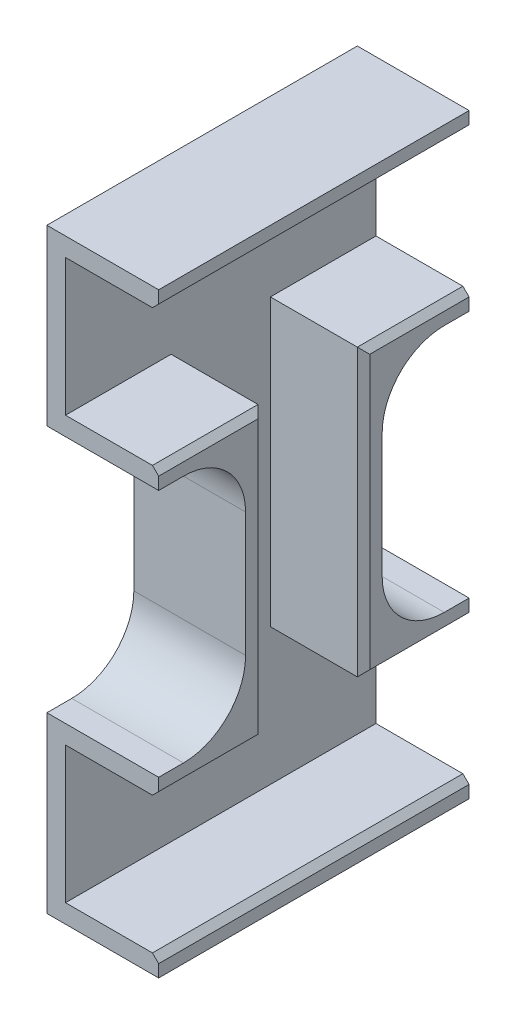
ISO-10303-21;
HEADER;
FILE_DESCRIPTION(('STEP AP214'),'2;1');
FILE_NAME('part.step','',(''),(''),'','','');
FILE_SCHEMA(('AUTOMOTIVE_DESIGN { 1 0 10303 214 1 1 1 1 }'));
ENDSEC;
DATA;
#1=APPLICATION_CONTEXT('core data for automotive mechanical design processes');
#2=APPLICATION_PROTOCOL_DEFINITION('international standard','automotive_design',2000,#1);
#3=PRODUCT_CONTEXT('',#1,'mechanical');
#4=PRODUCT('Part','Part','',(#3));
#5=PRODUCT_RELATED_PRODUCT_CATEGORY('part','',(#4));
#6=PRODUCT_DEFINITION_FORMATION('','',#4);
#7=PRODUCT_DEFINITION_CONTEXT('part definition',#1,'design');
#8=PRODUCT_DEFINITION('design','',#6,#7);
#9=PRODUCT_DEFINITION_SHAPE('','',#8);
#10=(LENGTH_UNIT() NAMED_UNIT(*) SI_UNIT(.MILLI.,.METRE.));
#11=(NAMED_UNIT(*) PLANE_ANGLE_UNIT() SI_UNIT($,.RADIAN.));
#12=(NAMED_UNIT(*) SI_UNIT($,.STERADIAN.) SOLID_ANGLE_UNIT());
#13=UNCERTAINTY_MEASURE_WITH_UNIT(LENGTH_MEASURE(1.E-05),#10,'distance_accuracy_value','');
#14=(GEOMETRIC_REPRESENTATION_CONTEXT(3) GLOBAL_UNCERTAINTY_ASSIGNED_CONTEXT((#13)) GLOBAL_UNIT_ASSIGNED_CONTEXT((#10,
#11,#12)) REPRESENTATION_CONTEXT('',''));
#15=CARTESIAN_POINT('',(0.,0.,0.));
#16=DIRECTION('',(0.,0.,1.));
#17=DIRECTION('',(1.,0.,0.));
#18=AXIS2_PLACEMENT_3D('',#15,#16,#17);
#19=CARTESIAN_POINT('',(18.,0.,-50.));
#20=DIRECTION('',(0.,0.,1.));
#21=DIRECTION('',(1.,0.,0.));
#22=AXIS2_PLACEMENT_3D('',#19,#20,#21);
#23=PLANE('',#22);
#24=DIRECTION('',(1.,0.,0.));
#25=VECTOR('',#24,1.);
#26=CARTESIAN_POINT('',(3.,3.,-50.));
#27=LINE('',#26,#25);
#28=CARTESIAN_POINT('',(3.,3.,-50.));
#29=VERTEX_POINT('',#28);
#30=CARTESIAN_POINT('',(17.,3.,-50.));
#31=VERTEX_POINT('',#30);
#32=EDGE_CURVE('E597',#29,#31,#27,.T.);
#33=ORIENTED_EDGE('',*,*,#32,.T.);
#34=DIRECTION('',(0.707106781186548,-0.707106781186548,0.));
#35=VECTOR('',#34,1.);
#36=CARTESIAN_POINT('',(17.,3.,-50.));
#37=LINE('',#36,#35);
#38=CARTESIAN_POINT('',(18.,1.99999999999997,-50.));
#39=VERTEX_POINT('',#38);
#40=EDGE_CURVE('E484',#31,#39,#37,.T.);
#41=ORIENTED_EDGE('',*,*,#40,.T.);
#42=DIRECTION('',(0.,1.,0.));
#43=VECTOR('',#42,1.);
#44=CARTESIAN_POINT('',(18.,0.,-50.));
#45=LINE('',#44,#43);
#46=CARTESIAN_POINT('',(18.,0.,-50.));
#47=VERTEX_POINT('',#46);
#48=EDGE_CURVE('E336',#47,#39,#45,.T.);
#49=ORIENTED_EDGE('',*,*,#48,.F.);
#50=DIRECTION('',(-1.,0.,0.));
#51=VECTOR('',#50,1.);
#52=CARTESIAN_POINT('',(18.,0.,-50.));
#53=LINE('',#52,#51);
#54=CARTESIAN_POINT('',(0.,0.,-50.));
#55=VERTEX_POINT('',#54);
#56=EDGE_CURVE('E415',#47,#55,#53,.T.);
#57=ORIENTED_EDGE('',*,*,#56,.T.);
#58=DIRECTION('',(0.,1.,0.));
#59=VECTOR('',#58,1.);
#60=CARTESIAN_POINT('',(0.,0.,-50.));
#61=LINE('',#60,#59);
#62=CARTESIAN_POINT('',(0.,28.,-50.));
#63=VERTEX_POINT('',#62);
#64=EDGE_CURVE('E380',#55,#63,#61,.T.);
#65=ORIENTED_EDGE('',*,*,#64,.T.);
#66=DIRECTION('',(-1.,0.,0.));
#67=VECTOR('',#66,1.);
#68=CARTESIAN_POINT('',(18.,28.,-50.));
#69=LINE('',#68,#67);
#70=CARTESIAN_POINT('',(18.,28.,-50.));
#71=VERTEX_POINT('',#70);
#72=EDGE_CURVE('E411',#71,#63,#69,.T.);
#73=ORIENTED_EDGE('',*,*,#72,.F.);
#74=CARTESIAN_POINT('',(18.,26.,-50.));
#75=VERTEX_POINT('',#74);
#76=EDGE_CURVE('E335',#75,#71,#45,.T.);
#77=ORIENTED_EDGE('',*,*,#76,.F.);
#78=DIRECTION('',(0.707106781186548,0.707106781186548,0.));
#79=VECTOR('',#78,1.);
#80=CARTESIAN_POINT('',(18.,26.,-50.));
#81=LINE('',#80,#79);
#82=CARTESIAN_POINT('',(17.,25.,-50.));
#83=VERTEX_POINT('',#82);
#84=EDGE_CURVE('E481',#75,#83,#81,.F.);
#85=ORIENTED_EDGE('',*,*,#84,.T.);
#86=DIRECTION('',(1.,0.,0.));
#87=VECTOR('',#86,1.);
#88=CARTESIAN_POINT('',(3.,25.,-50.));
#89=LINE('',#88,#87);
#90=CARTESIAN_POINT('',(3.,25.,-50.));
#91=VERTEX_POINT('',#90);
#92=EDGE_CURVE('E594',#91,#83,#89,.T.);
#93=ORIENTED_EDGE('',*,*,#92,.F.);
#94=DIRECTION('',(0.,1.,0.));
#95=VECTOR('',#94,1.);
#96=CARTESIAN_POINT('',(3.,0.,-50.));
#97=LINE('',#96,#95);
#98=EDGE_CURVE('E646',#29,#91,#97,.T.);
#99=ORIENTED_EDGE('',*,*,#98,.F.);
#100=EDGE_LOOP('',(#33,#41,#49,#57,#65,#73,#77,#85,#93,#99));
#101=FACE_BOUND('',#100,.T.);
#102=ADVANCED_FACE('F47',(#101),#23,.F.);
#103=CARTESIAN_POINT('',(18.,0.,-50.));
#104=DIRECTION('',(0.,0.,1.));
#105=DIRECTION('',(1.,0.,0.));
#106=AXIS2_PLACEMENT_3D('',#103,#104,#105);
#107=PLANE('',#106);
#108=DIRECTION('',(0.,1.,0.));
#109=VECTOR('',#108,1.);
#110=CARTESIAN_POINT('',(18.,0.,-50.));
#111=LINE('',#110,#109);
#112=CARTESIAN_POINT('',(18.,94.,-50.));
#113=VERTEX_POINT('',#112);
#114=CARTESIAN_POINT('',(18.,96.,-50.));
#115=VERTEX_POINT('',#114);
#116=EDGE_CURVE('E349',#113,#115,#111,.T.);
#117=ORIENTED_EDGE('',*,*,#116,.F.);
#118=DIRECTION('',(0.707106781186548,0.707106781186548,0.));
#119=VECTOR('',#118,1.);
#120=CARTESIAN_POINT('',(18.,94.,-50.));
#121=LINE('',#120,#119);
#122=CARTESIAN_POINT('',(17.,93.,-50.));
#123=VERTEX_POINT('',#122);
#124=EDGE_CURVE('E503',#113,#123,#121,.F.);
#125=ORIENTED_EDGE('',*,*,#124,.T.);
#126=DIRECTION('',(1.,0.,0.));
#127=VECTOR('',#126,1.);
#128=CARTESIAN_POINT('',(3.,93.,-50.));
#129=LINE('',#128,#127);
#130=CARTESIAN_POINT('',(3.,93.,-50.));
#131=VERTEX_POINT('',#130);
#132=EDGE_CURVE('E582',#131,#123,#129,.T.);
#133=ORIENTED_EDGE('',*,*,#132,.F.);
#134=DIRECTION('',(0.,1.,0.));
#135=VECTOR('',#134,1.);
#136=CARTESIAN_POINT('',(3.,0.,-50.));
#137=LINE('',#136,#135);
#138=CARTESIAN_POINT('',(3.,71.,-50.));
#139=VERTEX_POINT('',#138);
#140=EDGE_CURVE('E308',#139,#131,#137,.T.);
#141=ORIENTED_EDGE('',*,*,#140,.F.);
#142=DIRECTION('',(1.,0.,0.));
#143=VECTOR('',#142,1.);
#144=CARTESIAN_POINT('',(3.,71.,-50.));
#145=LINE('',#144,#143);
#146=CARTESIAN_POINT('',(17.,71.,-50.));
#147=VERTEX_POINT('',#146);
#148=EDGE_CURVE('E572',#139,#147,#145,.T.);
#149=ORIENTED_EDGE('',*,*,#148,.T.);
#150=DIRECTION('',(0.707106781186548,-0.707106781186548,0.));
#151=VECTOR('',#150,1.);
#152=CARTESIAN_POINT('',(17.,71.,-50.));
#153=LINE('',#152,#151);
#154=CARTESIAN_POINT('',(18.,70.,-50.));
#155=VERTEX_POINT('',#154);
#156=EDGE_CURVE('E500',#147,#155,#153,.T.);
#157=ORIENTED_EDGE('',*,*,#156,.T.);
#158=CARTESIAN_POINT('',(18.,68.,-50.));
#159=VERTEX_POINT('',#158);
#160=EDGE_CURVE('E344',#159,#155,#111,.T.);
#161=ORIENTED_EDGE('',*,*,#160,.F.);
#162=DIRECTION('',(-1.,0.,0.));
#163=VECTOR('',#162,1.);
#164=CARTESIAN_POINT('',(18.,68.,-50.));
#165=LINE('',#164,#163);
#166=CARTESIAN_POINT('',(0.,68.,-50.));
#167=VERTEX_POINT('',#166);
#168=EDGE_CURVE('E407',#159,#167,#165,.T.);
#169=ORIENTED_EDGE('',*,*,#168,.T.);
#170=DIRECTION('',(0.,1.,0.));
#171=VECTOR('',#170,1.);
#172=CARTESIAN_POINT('',(0.,0.,-50.));
#173=LINE('',#172,#171);
#174=CARTESIAN_POINT('',(0.,96.,-50.));
#175=VERTEX_POINT('',#174);
#176=EDGE_CURVE('E388',#167,#175,#173,.T.);
#177=ORIENTED_EDGE('',*,*,#176,.T.);
#178=DIRECTION('',(-1.,0.,0.));
#179=VECTOR('',#178,1.);
#180=CARTESIAN_POINT('',(18.,96.,-50.));
#181=LINE('',#180,#179);
#182=EDGE_CURVE('E404',#115,#175,#181,.T.);
#183=ORIENTED_EDGE('',*,*,#182,.F.);
#184=EDGE_LOOP('',(#117,#125,#133,#141,#149,#157,#161,#169,#177,#183));
#185=FACE_BOUND('',#184,.T.);
#186=ADVANCED_FACE('F578',(#185),#107,.F.);
#187=CARTESIAN_POINT('',(18.,0.,0.));
#188=DIRECTION('',(0.,0.,1.));
#189=DIRECTION('',(1.,0.,0.));
#190=AXIS2_PLACEMENT_3D('',#187,#188,#189);
#191=PLANE('',#190);
#192=DIRECTION('',(1.,0.,0.));
#193=VECTOR('',#192,1.);
#194=CARTESIAN_POINT('',(3.,93.,0.));
#195=LINE('',#194,#193);
#196=CARTESIAN_POINT('',(3.,93.,0.));
#197=VERTEX_POINT('',#196);
#198=CARTESIAN_POINT('',(17.,93.,0.));
#199=VERTEX_POINT('',#198);
#200=EDGE_CURVE('E363',#197,#199,#195,.T.);
#201=ORIENTED_EDGE('',*,*,#200,.T.);
#202=DIRECTION('',(-0.707106781186548,-0.707106781186548,0.));
#203=VECTOR('',#202,1.);
#204=CARTESIAN_POINT('',(-29.,47.,0.));
#205=LINE('',#204,#203);
#206=CARTESIAN_POINT('',(18.,94.,0.));
#207=VERTEX_POINT('',#206);
#208=EDGE_CURVE('E511',#199,#207,#205,.F.);
#209=ORIENTED_EDGE('',*,*,#208,.T.);
#210=DIRECTION('',(0.,1.,0.));
#211=VECTOR('',#210,1.);
#212=CARTESIAN_POINT('',(18.,0.,0.));
#213=LINE('',#212,#211);
#214=CARTESIAN_POINT('',(18.,96.,0.));
#215=VERTEX_POINT('',#214);
#216=EDGE_CURVE('E353',#207,#215,#213,.T.);
#217=ORIENTED_EDGE('',*,*,#216,.T.);
#218=DIRECTION('',(-1.,0.,0.));
#219=VECTOR('',#218,1.);
#220=CARTESIAN_POINT('',(18.,96.,0.));
#221=LINE('',#220,#219);
#222=CARTESIAN_POINT('',(0.,96.,0.));
#223=VERTEX_POINT('',#222);
#224=EDGE_CURVE('E401',#215,#223,#221,.T.);
#225=ORIENTED_EDGE('',*,*,#224,.T.);
#226=DIRECTION('',(0.,1.,0.));
#227=VECTOR('',#226,1.);
#228=CARTESIAN_POINT('',(0.,0.,0.));
#229=LINE('',#228,#227);
#230=CARTESIAN_POINT('',(0.,68.,0.));
#231=VERTEX_POINT('',#230);
#232=EDGE_CURVE('E317',#231,#223,#229,.T.);
#233=ORIENTED_EDGE('',*,*,#232,.F.);
#234=DIRECTION('',(-1.,0.,0.));
#235=VECTOR('',#234,1.);
#236=CARTESIAN_POINT('',(18.,68.,0.));
#237=LINE('',#236,#235);
#238=CARTESIAN_POINT('',(18.,68.,0.));
#239=VERTEX_POINT('',#238);
#240=EDGE_CURVE('E357',#239,#231,#237,.T.);
#241=ORIENTED_EDGE('',*,*,#240,.F.);
#242=CARTESIAN_POINT('',(18.,70.,0.));
#243=VERTEX_POINT('',#242);
#244=EDGE_CURVE('E354',#239,#243,#213,.T.);
#245=ORIENTED_EDGE('',*,*,#244,.T.);
#246=DIRECTION('',(-0.707106781186548,0.707106781186548,0.));
#247=VECTOR('',#246,1.);
#248=CARTESIAN_POINT('',(53.,35.,0.));
#249=LINE('',#248,#247);
#250=CARTESIAN_POINT('',(17.,71.,0.));
#251=VERTEX_POINT('',#250);
#252=EDGE_CURVE('E301',#243,#251,#249,.T.);
#253=ORIENTED_EDGE('',*,*,#252,.T.);
#254=DIRECTION('',(1.,0.,0.));
#255=VECTOR('',#254,1.);
#256=CARTESIAN_POINT('',(3.,71.,0.));
#257=LINE('',#256,#255);
#258=CARTESIAN_POINT('',(3.,71.,0.));
#259=VERTEX_POINT('',#258);
#260=EDGE_CURVE('E276',#259,#251,#257,.T.);
#261=ORIENTED_EDGE('',*,*,#260,.F.);
#262=DIRECTION('',(0.,-1.,0.));
#263=VECTOR('',#262,1.);
#264=CARTESIAN_POINT('',(3.,0.,0.));
#265=LINE('',#264,#263);
#266=EDGE_CURVE('E285',#197,#259,#265,.T.);
#267=ORIENTED_EDGE('',*,*,#266,.F.);
#268=EDGE_LOOP('',(#201,#209,#217,#225,#233,#241,#245,#253,#261,#267));
#269=FACE_BOUND('',#268,.T.);
#270=ADVANCED_FACE('F298',(#269),#191,.T.);
#271=CARTESIAN_POINT('',(18.,0.,0.));
#272=DIRECTION('',(1.,0.,0.));
#273=DIRECTION('',(0.,0.,-1.));
#274=AXIS2_PLACEMENT_3D('',#271,#272,#273);
#275=PLANE('',#274);
#276=ORIENTED_EDGE('',*,*,#216,.F.);
#277=DIRECTION('',(0.,0.,-1.));
#278=VECTOR('',#277,1.);
#279=CARTESIAN_POINT('',(18.,94.,0.));
#280=LINE('',#279,#278);
#281=EDGE_CURVE('E496',#207,#113,#280,.T.);
#282=ORIENTED_EDGE('',*,*,#281,.T.);
#283=ORIENTED_EDGE('',*,*,#116,.T.);
#284=DIRECTION('',(0.,0.,-1.));
#285=VECTOR('',#284,1.);
#286=CARTESIAN_POINT('',(18.,96.,0.));
#287=LINE('',#286,#285);
#288=EDGE_CURVE('E348',#215,#115,#287,.T.);
#289=ORIENTED_EDGE('',*,*,#288,.F.);
#290=EDGE_LOOP('',(#276,#282,#283,#289));
#291=FACE_BOUND('',#290,.T.);
#292=ADVANCED_FACE('F735',(#291),#275,.T.);
#293=DIRECTION('',(0.,-1.,0.));
#294=VECTOR('',#293,1.);
#295=CARTESIAN_POINT('',(18.,0.,-34.0000000000001));
#296=LINE('',#295,#294);
#297=CARTESIAN_POINT('',(18.,70.,-34.));
#298=VERTEX_POINT('',#297);
#299=CARTESIAN_POINT('',(18.,26.,-34.));
#300=VERTEX_POINT('',#299);
#301=EDGE_CURVE('E536',#298,#300,#296,.T.);
#302=ORIENTED_EDGE('',*,*,#301,.T.);
#303=DIRECTION('',(0.,0.,-1.));
#304=VECTOR('',#303,1.);
#305=CARTESIAN_POINT('',(18.,26.,0.));
#306=LINE('',#305,#304);
#307=EDGE_CURVE('E539',#300,#75,#306,.T.);
#308=ORIENTED_EDGE('',*,*,#307,.T.);
#309=ORIENTED_EDGE('',*,*,#76,.T.);
#310=DIRECTION('',(0.,0.,-1.));
#311=VECTOR('',#310,1.);
#312=CARTESIAN_POINT('',(18.,28.,0.));
#313=LINE('',#312,#311);
#314=CARTESIAN_POINT('',(18.,28.,-46.));
#315=VERTEX_POINT('',#314);
#316=EDGE_CURVE('E327',#315,#71,#313,.T.);
#317=ORIENTED_EDGE('',*,*,#316,.F.);
#318=CARTESIAN_POINT('',(18.,38.,-46.));
#319=DIRECTION('',(1.,0.,0.));
#320=DIRECTION('',(0.,0.,-1.));
#321=AXIS2_PLACEMENT_3D('',#318,#319,#320);
#322=CIRCLE('',#321,10.);
#323=CARTESIAN_POINT('',(18.,38.,-36.));
#324=VERTEX_POINT('',#323);
#325=EDGE_CURVE('E456',#315,#324,#322,.F.);
#326=ORIENTED_EDGE('',*,*,#325,.T.);
#327=DIRECTION('',(0.,1.,0.));
#328=VECTOR('',#327,1.);
#329=CARTESIAN_POINT('',(18.,0.,-36.));
#330=LINE('',#329,#328);
#331=CARTESIAN_POINT('',(18.,58.,-36.));
#332=VERTEX_POINT('',#331);
#333=EDGE_CURVE('E340',#324,#332,#330,.T.);
#334=ORIENTED_EDGE('',*,*,#333,.T.);
#335=CARTESIAN_POINT('',(18.,58.,-46.));
#336=DIRECTION('',(1.,0.,0.));
#337=DIRECTION('',(0.,0.,-1.));
#338=AXIS2_PLACEMENT_3D('',#335,#336,#337);
#339=CIRCLE('',#338,10.);
#340=CARTESIAN_POINT('',(18.,68.,-46.));
#341=VERTEX_POINT('',#340);
#342=EDGE_CURVE('E462',#332,#341,#339,.F.);
#343=ORIENTED_EDGE('',*,*,#342,.T.);
#344=DIRECTION('',(0.,0.,-1.));
#345=VECTOR('',#344,1.);
#346=CARTESIAN_POINT('',(18.,68.,0.));
#347=LINE('',#346,#345);
#348=EDGE_CURVE('E318',#341,#159,#347,.T.);
#349=ORIENTED_EDGE('',*,*,#348,.T.);
#350=ORIENTED_EDGE('',*,*,#160,.T.);
#351=DIRECTION('',(0.,0.,1.));
#352=VECTOR('',#351,1.);
#353=CARTESIAN_POINT('',(18.,70.,-33.));
#354=LINE('',#353,#352);
#355=EDGE_CURVE('E533',#155,#298,#354,.T.);
#356=ORIENTED_EDGE('',*,*,#355,.T.);
#357=EDGE_LOOP('',(#302,#308,#309,#317,#326,#334,#343,#349,#350,#356));
#358=FACE_BOUND('',#357,.T.);
#359=ADVANCED_FACE('F719',(#358),#275,.T.);
#360=DIRECTION('',(0.,1.,0.));
#361=VECTOR('',#360,1.);
#362=CARTESIAN_POINT('',(18.,0.,0.));
#363=LINE('',#362,#361);
#364=CARTESIAN_POINT('',(18.,26.,0.));
#365=VERTEX_POINT('',#364);
#366=CARTESIAN_POINT('',(18.,28.,0.));
#367=VERTEX_POINT('',#366);
#368=EDGE_CURVE('E326',#365,#367,#363,.T.);
#369=ORIENTED_EDGE('',*,*,#368,.F.);
#370=DIRECTION('',(0.,0.,-1.));
#371=VECTOR('',#370,1.);
#372=CARTESIAN_POINT('',(18.,26.,0.));
#373=LINE('',#372,#371);
#374=CARTESIAN_POINT('',(18.,26.,-16.));
#375=VERTEX_POINT('',#374);
#376=EDGE_CURVE('E520',#365,#375,#373,.T.);
#377=ORIENTED_EDGE('',*,*,#376,.T.);
#378=DIRECTION('',(0.,1.,0.));
#379=VECTOR('',#378,1.);
#380=CARTESIAN_POINT('',(18.,71.,-16.));
#381=LINE('',#380,#379);
#382=CARTESIAN_POINT('',(18.,70.,-16.));
#383=VERTEX_POINT('',#382);
#384=EDGE_CURVE('E517',#375,#383,#381,.T.);
#385=ORIENTED_EDGE('',*,*,#384,.T.);
#386=DIRECTION('',(0.,0.,1.));
#387=VECTOR('',#386,1.);
#388=CARTESIAN_POINT('',(18.,70.,0.));
#389=LINE('',#388,#387);
#390=EDGE_CURVE('E514',#383,#243,#389,.T.);
#391=ORIENTED_EDGE('',*,*,#390,.T.);
#392=ORIENTED_EDGE('',*,*,#244,.F.);
#393=CARTESIAN_POINT('',(18.,68.,-4.));
#394=VERTEX_POINT('',#393);
#395=EDGE_CURVE('E312',#239,#394,#347,.T.);
#396=ORIENTED_EDGE('',*,*,#395,.T.);
#397=CARTESIAN_POINT('',(18.,58.,-4.));
#398=DIRECTION('',(1.,0.,0.));
#399=DIRECTION('',(0.,0.,-1.));
#400=AXIS2_PLACEMENT_3D('',#397,#398,#399);
#401=CIRCLE('',#400,10.);
#402=CARTESIAN_POINT('',(18.,58.,-14.));
#403=VERTEX_POINT('',#402);
#404=EDGE_CURVE('E474',#394,#403,#401,.F.);
#405=ORIENTED_EDGE('',*,*,#404,.T.);
#406=DIRECTION('',(0.,1.,0.));
#407=VECTOR('',#406,1.);
#408=CARTESIAN_POINT('',(18.,0.,-14.));
#409=LINE('',#408,#407);
#410=CARTESIAN_POINT('',(18.,38.,-14.));
#411=VERTEX_POINT('',#410);
#412=EDGE_CURVE('E316',#411,#403,#409,.T.);
#413=ORIENTED_EDGE('',*,*,#412,.F.);
#414=CARTESIAN_POINT('',(18.,38.,-4.));
#415=DIRECTION('',(1.,0.,0.));
#416=DIRECTION('',(0.,0.,-1.));
#417=AXIS2_PLACEMENT_3D('',#414,#415,#416);
#418=CIRCLE('',#417,10.);
#419=CARTESIAN_POINT('',(18.,28.,-4.));
#420=VERTEX_POINT('',#419);
#421=EDGE_CURVE('E468',#411,#420,#418,.F.);
#422=ORIENTED_EDGE('',*,*,#421,.T.);
#423=EDGE_CURVE('E322',#367,#420,#313,.T.);
#424=ORIENTED_EDGE('',*,*,#423,.F.);
#425=EDGE_LOOP('',(#369,#377,#385,#391,#392,#396,#405,#413,#422,#424));
#426=FACE_BOUND('',#425,.T.);
#427=ADVANCED_FACE('F630',(#426),#275,.T.);
#428=CARTESIAN_POINT('',(18.,68.,0.));
#429=DIRECTION('',(0.,1.,0.));
#430=DIRECTION('',(0.,0.,1.));
#431=AXIS2_PLACEMENT_3D('',#428,#429,#430);
#432=PLANE('',#431);
#433=DIRECTION('',(0.,0.,-1.));
#434=VECTOR('',#433,1.);
#435=CARTESIAN_POINT('',(0.,68.,0.));
#436=LINE('',#435,#434);
#437=CARTESIAN_POINT('',(0.,68.,-4.));
#438=VERTEX_POINT('',#437);
#439=EDGE_CURVE('E358',#231,#438,#436,.T.);
#440=ORIENTED_EDGE('',*,*,#439,.T.);
#441=DIRECTION('',(-1.,0.,0.));
#442=VECTOR('',#441,1.);
#443=CARTESIAN_POINT('',(18.,68.,-4.));
#444=LINE('',#443,#442);
#445=EDGE_CURVE('E450',#438,#394,#444,.F.);
#446=ORIENTED_EDGE('',*,*,#445,.T.);
#447=ORIENTED_EDGE('',*,*,#395,.F.);
#448=ORIENTED_EDGE('',*,*,#240,.T.);
#449=EDGE_LOOP('',(#440,#446,#447,#448));
#450=FACE_BOUND('',#449,.T.);
#451=ADVANCED_FACE('F670',(#450),#432,.F.);
#452=CARTESIAN_POINT('',(18.,0.,-14.));
#453=DIRECTION('',(0.,0.,1.));
#454=DIRECTION('',(1.,0.,0.));
#455=AXIS2_PLACEMENT_3D('',#452,#453,#454);
#456=PLANE('',#455);
#457=DIRECTION('',(0.,1.,0.));
#458=VECTOR('',#457,1.);
#459=CARTESIAN_POINT('',(0.,0.,-14.));
#460=LINE('',#459,#458);
#461=CARTESIAN_POINT('',(0.,38.,-14.));
#462=VERTEX_POINT('',#461);
#463=CARTESIAN_POINT('',(0.,58.,-14.));
#464=VERTEX_POINT('',#463);
#465=EDGE_CURVE('E362',#462,#464,#460,.T.);
#466=ORIENTED_EDGE('',*,*,#465,.F.);
#467=DIRECTION('',(-1.,0.,0.));
#468=VECTOR('',#467,1.);
#469=CARTESIAN_POINT('',(18.,38.,-14.));
#470=LINE('',#469,#468);
#471=EDGE_CURVE('E447',#462,#411,#470,.F.);
#472=ORIENTED_EDGE('',*,*,#471,.T.);
#473=ORIENTED_EDGE('',*,*,#412,.T.);
#474=DIRECTION('',(-1.,0.,0.));
#475=VECTOR('',#474,1.);
#476=CARTESIAN_POINT('',(18.,58.,-14.));
#477=LINE('',#476,#475);
#478=EDGE_CURVE('E443',#403,#464,#477,.T.);
#479=ORIENTED_EDGE('',*,*,#478,.T.);
#480=EDGE_LOOP('',(#466,#472,#473,#479));
#481=FACE_BOUND('',#480,.T.);
#482=ADVANCED_FACE('F679',(#481),#456,.T.);
#483=CARTESIAN_POINT('',(18.,28.,0.));
#484=DIRECTION('',(0.,1.,0.));
#485=DIRECTION('',(0.,0.,1.));
#486=AXIS2_PLACEMENT_3D('',#483,#484,#485);
#487=PLANE('',#486);
#488=ORIENTED_EDGE('',*,*,#423,.T.);
#489=DIRECTION('',(-1.,0.,0.));
#490=VECTOR('',#489,1.);
#491=CARTESIAN_POINT('',(0.,28.,-4.));
#492=LINE('',#491,#490);
#493=CARTESIAN_POINT('',(0.,28.,-4.));
#494=VERTEX_POINT('',#493);
#495=EDGE_CURVE('E439',#420,#494,#492,.T.);
#496=ORIENTED_EDGE('',*,*,#495,.T.);
#497=DIRECTION('',(0.,0.,-1.));
#498=VECTOR('',#497,1.);
#499=CARTESIAN_POINT('',(0.,28.,0.));
#500=LINE('',#499,#498);
#501=CARTESIAN_POINT('',(0.,28.,0.));
#502=VERTEX_POINT('',#501);
#503=EDGE_CURVE('E368',#502,#494,#500,.T.);
#504=ORIENTED_EDGE('',*,*,#503,.F.);
#505=DIRECTION('',(-1.,0.,0.));
#506=VECTOR('',#505,1.);
#507=CARTESIAN_POINT('',(18.,28.,0.));
#508=LINE('',#507,#506);
#509=EDGE_CURVE('E422',#367,#502,#508,.T.);
#510=ORIENTED_EDGE('',*,*,#509,.F.);
#511=EDGE_LOOP('',(#488,#496,#504,#510));
#512=FACE_BOUND('',#511,.T.);
#513=ADVANCED_FACE('F689',(#512),#487,.T.);
#514=CARTESIAN_POINT('',(18.,0.,0.));
#515=DIRECTION('',(0.,0.,1.));
#516=DIRECTION('',(1.,0.,0.));
#517=AXIS2_PLACEMENT_3D('',#514,#515,#516);
#518=PLANE('',#517);
#519=CARTESIAN_POINT('',(18.,0.,0.));
#520=VERTEX_POINT('',#519);
#521=CARTESIAN_POINT('',(18.,1.99999999999997,0.));
#522=VERTEX_POINT('',#521);
#523=EDGE_CURVE('E328',#520,#522,#363,.T.);
#524=ORIENTED_EDGE('',*,*,#523,.T.);
#525=DIRECTION('',(-0.707106781186548,0.707106781186548,0.));
#526=VECTOR('',#525,1.);
#527=CARTESIAN_POINT('',(19.,0.999999999999987,0.));
#528=LINE('',#527,#526);
#529=CARTESIAN_POINT('',(17.,3.,0.));
#530=VERTEX_POINT('',#529);
#531=EDGE_CURVE('E493',#522,#530,#528,.T.);
#532=ORIENTED_EDGE('',*,*,#531,.T.);
#533=DIRECTION('',(1.,0.,0.));
#534=VECTOR('',#533,1.);
#535=CARTESIAN_POINT('',(3.,3.,0.));
#536=LINE('',#535,#534);
#537=CARTESIAN_POINT('',(3.,3.,0.));
#538=VERTEX_POINT('',#537);
#539=EDGE_CURVE('E601',#538,#530,#536,.T.);
#540=ORIENTED_EDGE('',*,*,#539,.F.);
#541=DIRECTION('',(0.,-1.,0.));
#542=VECTOR('',#541,1.);
#543=CARTESIAN_POINT('',(3.,0.,0.));
#544=LINE('',#543,#542);
#545=CARTESIAN_POINT('',(3.,25.,0.));
#546=VERTEX_POINT('',#545);
#547=EDGE_CURVE('E654',#546,#538,#544,.T.);
#548=ORIENTED_EDGE('',*,*,#547,.F.);
#549=DIRECTION('',(1.,0.,0.));
#550=VECTOR('',#549,1.);
#551=CARTESIAN_POINT('',(3.,25.,0.));
#552=LINE('',#551,#550);
#553=CARTESIAN_POINT('',(17.,25.,0.));
#554=VERTEX_POINT('',#553);
#555=EDGE_CURVE('E605',#546,#554,#552,.T.);
#556=ORIENTED_EDGE('',*,*,#555,.T.);
#557=DIRECTION('',(-0.707106781186548,-0.707106781186548,0.));
#558=VECTOR('',#557,1.);
#559=CARTESIAN_POINT('',(4.99999999999999,13.,0.));
#560=LINE('',#559,#558);
#561=EDGE_CURVE('E490',#554,#365,#560,.F.);
#562=ORIENTED_EDGE('',*,*,#561,.T.);
#563=ORIENTED_EDGE('',*,*,#368,.T.);
#564=ORIENTED_EDGE('',*,*,#509,.T.);
#565=DIRECTION('',(0.,1.,0.));
#566=VECTOR('',#565,1.);
#567=CARTESIAN_POINT('',(0.,0.,0.));
#568=LINE('',#567,#566);
#569=CARTESIAN_POINT('',(0.,0.,0.));
#570=VERTEX_POINT('',#569);
#571=EDGE_CURVE('E372',#570,#502,#568,.T.);
#572=ORIENTED_EDGE('',*,*,#571,.F.);
#573=DIRECTION('',(-1.,0.,0.));
#574=VECTOR('',#573,1.);
#575=CARTESIAN_POINT('',(18.,0.,0.));
#576=LINE('',#575,#574);
#577=EDGE_CURVE('E419',#520,#570,#576,.T.);
#578=ORIENTED_EDGE('',*,*,#577,.F.);
#579=EDGE_LOOP('',(#524,#532,#540,#548,#556,#562,#563,#564,#572,#578));
#580=FACE_BOUND('',#579,.T.);
#581=ADVANCED_FACE('F691',(#580),#518,.T.);
#582=CARTESIAN_POINT('',(18.,0.,0.));
#583=DIRECTION('',(0.,1.,0.));
#584=DIRECTION('',(0.,0.,1.));
#585=AXIS2_PLACEMENT_3D('',#582,#583,#584);
#586=PLANE('',#585);
#587=DIRECTION('',(0.,0.,-1.));
#588=VECTOR('',#587,1.);
#589=CARTESIAN_POINT('',(0.,0.,0.));
#590=LINE('',#589,#588);
#591=EDGE_CURVE('E377',#570,#55,#590,.T.);
#592=ORIENTED_EDGE('',*,*,#591,.T.);
#593=ORIENTED_EDGE('',*,*,#56,.F.);
#594=DIRECTION('',(0.,0.,-1.));
#595=VECTOR('',#594,1.);
#596=CARTESIAN_POINT('',(18.,0.,0.));
#597=LINE('',#596,#595);
#598=EDGE_CURVE('E332',#520,#47,#597,.T.);
#599=ORIENTED_EDGE('',*,*,#598,.F.);
#600=ORIENTED_EDGE('',*,*,#577,.T.);
#601=EDGE_LOOP('',(#592,#593,#599,#600));
#602=FACE_BOUND('',#601,.T.);
#603=ADVANCED_FACE('F697',(#602),#586,.F.);
#604=CARTESIAN_POINT('',(0.,28.,-46.));
#605=VERTEX_POINT('',#604);
#606=EDGE_CURVE('E373',#605,#63,#500,.T.);
#607=ORIENTED_EDGE('',*,*,#606,.F.);
#608=DIRECTION('',(-1.,0.,0.));
#609=VECTOR('',#608,1.);
#610=CARTESIAN_POINT('',(18.,28.,-46.));
#611=LINE('',#610,#609);
#612=EDGE_CURVE('E432',#605,#315,#611,.F.);
#613=ORIENTED_EDGE('',*,*,#612,.T.);
#614=ORIENTED_EDGE('',*,*,#316,.T.);
#615=ORIENTED_EDGE('',*,*,#72,.T.);
#616=EDGE_LOOP('',(#607,#613,#614,#615));
#617=FACE_BOUND('',#616,.T.);
#618=ADVANCED_FACE('F759',(#617),#487,.T.);
#619=CARTESIAN_POINT('',(18.,0.,-36.));
#620=DIRECTION('',(0.,0.,1.));
#621=DIRECTION('',(1.,0.,0.));
#622=AXIS2_PLACEMENT_3D('',#619,#620,#621);
#623=PLANE('',#622);
#624=ORIENTED_EDGE('',*,*,#333,.F.);
#625=DIRECTION('',(-1.,0.,0.));
#626=VECTOR('',#625,1.);
#627=CARTESIAN_POINT('',(18.,38.,-36.));
#628=LINE('',#627,#626);
#629=CARTESIAN_POINT('',(0.,38.,-36.));
#630=VERTEX_POINT('',#629);
#631=EDGE_CURVE('E428',#324,#630,#628,.T.);
#632=ORIENTED_EDGE('',*,*,#631,.T.);
#633=DIRECTION('',(0.,1.,0.));
#634=VECTOR('',#633,1.);
#635=CARTESIAN_POINT('',(0.,0.,-36.));
#636=LINE('',#635,#634);
#637=CARTESIAN_POINT('',(0.,58.,-36.));
#638=VERTEX_POINT('',#637);
#639=EDGE_CURVE('E384',#630,#638,#636,.T.);
#640=ORIENTED_EDGE('',*,*,#639,.T.);
#641=DIRECTION('',(-1.,0.,0.));
#642=VECTOR('',#641,1.);
#643=CARTESIAN_POINT('',(18.,58.,-36.));
#644=LINE('',#643,#642);
#645=EDGE_CURVE('E425',#638,#332,#644,.F.);
#646=ORIENTED_EDGE('',*,*,#645,.T.);
#647=EDGE_LOOP('',(#624,#632,#640,#646));
#648=FACE_BOUND('',#647,.T.);
#649=ADVANCED_FACE('F751',(#648),#623,.F.);
#650=ORIENTED_EDGE('',*,*,#348,.F.);
#651=DIRECTION('',(-1.,0.,0.));
#652=VECTOR('',#651,1.);
#653=CARTESIAN_POINT('',(0.,68.,-46.));
#654=LINE('',#653,#652);
#655=CARTESIAN_POINT('',(0.,68.,-46.));
#656=VERTEX_POINT('',#655);
#657=EDGE_CURVE('E435',#341,#656,#654,.T.);
#658=ORIENTED_EDGE('',*,*,#657,.T.);
#659=EDGE_CURVE('E364',#656,#167,#436,.T.);
#660=ORIENTED_EDGE('',*,*,#659,.T.);
#661=ORIENTED_EDGE('',*,*,#168,.F.);
#662=EDGE_LOOP('',(#650,#658,#660,#661));
#663=FACE_BOUND('',#662,.T.);
#664=ADVANCED_FACE('F743',(#663),#432,.F.);
#665=CARTESIAN_POINT('',(18.,96.,0.));
#666=DIRECTION('',(0.,1.,0.));
#667=DIRECTION('',(0.,0.,1.));
#668=AXIS2_PLACEMENT_3D('',#665,#666,#667);
#669=PLANE('',#668);
#670=DIRECTION('',(0.,0.,-1.));
#671=VECTOR('',#670,1.);
#672=CARTESIAN_POINT('',(0.,96.,0.));
#673=LINE('',#672,#671);
#674=EDGE_CURVE('E392',#223,#175,#673,.T.);
#675=ORIENTED_EDGE('',*,*,#674,.F.);
#676=ORIENTED_EDGE('',*,*,#224,.F.);
#677=ORIENTED_EDGE('',*,*,#288,.T.);
#678=ORIENTED_EDGE('',*,*,#182,.T.);
#679=EDGE_LOOP('',(#675,#676,#677,#678));
#680=FACE_BOUND('',#679,.T.);
#681=ADVANCED_FACE('F734',(#680),#669,.T.);
#682=ORIENTED_EDGE('',*,*,#48,.T.);
#683=DIRECTION('',(0.,0.,1.));
#684=VECTOR('',#683,1.);
#685=CARTESIAN_POINT('',(18.,1.99999999999997,0.));
#686=LINE('',#685,#684);
#687=EDGE_CURVE('E487',#39,#522,#686,.T.);
#688=ORIENTED_EDGE('',*,*,#687,.T.);
#689=ORIENTED_EDGE('',*,*,#523,.F.);
#690=ORIENTED_EDGE('',*,*,#598,.T.);
#691=EDGE_LOOP('',(#682,#688,#689,#690));
#692=FACE_BOUND('',#691,.T.);
#693=ADVANCED_FACE('F703',(#692),#275,.T.);
#694=CARTESIAN_POINT('',(0.,0.,0.));
#695=DIRECTION('',(1.,0.,0.));
#696=DIRECTION('',(0.,0.,-1.));
#697=AXIS2_PLACEMENT_3D('',#694,#695,#696);
#698=PLANE('',#697);
#699=ORIENTED_EDGE('',*,*,#439,.F.);
#700=ORIENTED_EDGE('',*,*,#232,.T.);
#701=ORIENTED_EDGE('',*,*,#674,.T.);
#702=ORIENTED_EDGE('',*,*,#176,.F.);
#703=ORIENTED_EDGE('',*,*,#659,.F.);
#704=CARTESIAN_POINT('',(0.,58.,-46.));
#705=DIRECTION('',(1.,0.,0.));
#706=DIRECTION('',(0.,0.,-1.));
#707=AXIS2_PLACEMENT_3D('',#704,#705,#706);
#708=CIRCLE('',#707,10.);
#709=EDGE_CURVE('E459',#656,#638,#708,.T.);
#710=ORIENTED_EDGE('',*,*,#709,.T.);
#711=ORIENTED_EDGE('',*,*,#639,.F.);
#712=CARTESIAN_POINT('',(0.,38.,-46.));
#713=DIRECTION('',(1.,0.,0.));
#714=DIRECTION('',(0.,0.,-1.));
#715=AXIS2_PLACEMENT_3D('',#712,#713,#714);
#716=CIRCLE('',#715,10.);
#717=EDGE_CURVE('E453',#630,#605,#716,.T.);
#718=ORIENTED_EDGE('',*,*,#717,.T.);
#719=ORIENTED_EDGE('',*,*,#606,.T.);
#720=ORIENTED_EDGE('',*,*,#64,.F.);
#721=ORIENTED_EDGE('',*,*,#591,.F.);
#722=ORIENTED_EDGE('',*,*,#571,.T.);
#723=ORIENTED_EDGE('',*,*,#503,.T.);
#724=CARTESIAN_POINT('',(0.,38.,-4.));
#725=DIRECTION('',(1.,0.,0.));
#726=DIRECTION('',(0.,0.,-1.));
#727=AXIS2_PLACEMENT_3D('',#724,#725,#726);
#728=CIRCLE('',#727,10.);
#729=EDGE_CURVE('E465',#494,#462,#728,.T.);
#730=ORIENTED_EDGE('',*,*,#729,.T.);
#731=ORIENTED_EDGE('',*,*,#465,.T.);
#732=CARTESIAN_POINT('',(0.,58.,-4.));
#733=DIRECTION('',(1.,0.,0.));
#734=DIRECTION('',(0.,0.,-1.));
#735=AXIS2_PLACEMENT_3D('',#732,#733,#734);
#736=CIRCLE('',#735,10.);
#737=EDGE_CURVE('E471',#464,#438,#736,.T.);
#738=ORIENTED_EDGE('',*,*,#737,.T.);
#739=EDGE_LOOP('',(#699,#700,#701,#702,#703,#710,#711,#718,#719,#720,#721,#722,#723,#730,#731,#738));
#740=FACE_BOUND('',#739,.T.);
#741=ADVANCED_FACE('F682',(#740),#698,.F.);
#742=CARTESIAN_POINT('',(3.,93.,0.));
#743=DIRECTION('',(0.,-1.,0.));
#744=DIRECTION('',(0.,0.,-1.));
#745=AXIS2_PLACEMENT_3D('',#742,#743,#744);
#746=PLANE('',#745);
#747=ORIENTED_EDGE('',*,*,#132,.T.);
#748=DIRECTION('',(0.,0.,1.));
#749=VECTOR('',#748,1.);
#750=CARTESIAN_POINT('',(17.,93.,0.));
#751=LINE('',#750,#749);
#752=EDGE_CURVE('E506',#123,#199,#751,.T.);
#753=ORIENTED_EDGE('',*,*,#752,.T.);
#754=ORIENTED_EDGE('',*,*,#200,.F.);
#755=DIRECTION('',(0.,0.,-1.));
#756=VECTOR('',#755,1.);
#757=CARTESIAN_POINT('',(3.,93.,0.));
#758=LINE('',#757,#756);
#759=EDGE_CURVE('E292',#197,#131,#758,.T.);
#760=ORIENTED_EDGE('',*,*,#759,.T.);
#761=EDGE_LOOP('',(#747,#753,#754,#760));
#762=FACE_BOUND('',#761,.T.);
#763=ADVANCED_FACE('F915',(#762),#746,.T.);
#764=CARTESIAN_POINT('',(3.,71.,0.));
#765=DIRECTION('',(0.,-1.,0.));
#766=DIRECTION('',(0.,0.,-1.));
#767=AXIS2_PLACEMENT_3D('',#764,#765,#766);
#768=PLANE('',#767);
#769=DIRECTION('',(1.,0.,0.));
#770=VECTOR('',#769,1.);
#771=CARTESIAN_POINT('',(3.,71.,-33.));
#772=LINE('',#771,#770);
#773=CARTESIAN_POINT('',(3.,71.,-33.));
#774=VERTEX_POINT('',#773);
#775=CARTESIAN_POINT('',(17.,71.,-33.));
#776=VERTEX_POINT('',#775);
#777=EDGE_CURVE('E574',#774,#776,#772,.T.);
#778=ORIENTED_EDGE('',*,*,#777,.T.);
#779=DIRECTION('',(0.,0.,-1.));
#780=VECTOR('',#779,1.);
#781=CARTESIAN_POINT('',(17.,71.,-50.));
#782=LINE('',#781,#780);
#783=EDGE_CURVE('E11',#776,#147,#782,.T.);
#784=ORIENTED_EDGE('',*,*,#783,.T.);
#785=ORIENTED_EDGE('',*,*,#148,.F.);
#786=DIRECTION('',(0.,0.,-1.));
#787=VECTOR('',#786,1.);
#788=CARTESIAN_POINT('',(3.,71.,0.));
#789=LINE('',#788,#787);
#790=EDGE_CURVE('E287',#774,#139,#789,.T.);
#791=ORIENTED_EDGE('',*,*,#790,.F.);
#792=EDGE_LOOP('',(#778,#784,#785,#791));
#793=FACE_BOUND('',#792,.T.);
#794=ADVANCED_FACE('F570',(#793),#768,.F.);
#795=CARTESIAN_POINT('',(3.,0.,-33.));
#796=DIRECTION('',(0.,0.,1.));
#797=DIRECTION('',(0.,-1.,0.));
#798=AXIS2_PLACEMENT_3D('',#795,#796,#797);
#799=PLANE('',#798);
#800=DIRECTION('',(1.,0.,0.));
#801=VECTOR('',#800,1.);
#802=CARTESIAN_POINT('',(3.,25.,-33.));
#803=LINE('',#802,#801);
#804=CARTESIAN_POINT('',(3.,25.,-33.));
#805=VERTEX_POINT('',#804);
#806=CARTESIAN_POINT('',(17.,25.,-33.));
#807=VERTEX_POINT('',#806);
#808=EDGE_CURVE('E588',#805,#807,#803,.T.);
#809=ORIENTED_EDGE('',*,*,#808,.T.);
#810=DIRECTION('',(0.,1.,0.));
#811=VECTOR('',#810,1.);
#812=CARTESIAN_POINT('',(17.,0.,-33.));
#813=LINE('',#812,#811);
#814=EDGE_CURVE('E58',#807,#776,#813,.T.);
#815=ORIENTED_EDGE('',*,*,#814,.T.);
#816=ORIENTED_EDGE('',*,*,#777,.F.);
#817=DIRECTION('',(0.,-1.,0.));
#818=VECTOR('',#817,1.);
#819=CARTESIAN_POINT('',(3.,0.,-33.));
#820=LINE('',#819,#818);
#821=EDGE_CURVE('E642',#774,#805,#820,.T.);
#822=ORIENTED_EDGE('',*,*,#821,.T.);
#823=EDGE_LOOP('',(#809,#815,#816,#822));
#824=FACE_BOUND('',#823,.T.);
#825=ADVANCED_FACE('F903',(#824),#799,.T.);
#826=CARTESIAN_POINT('',(3.,25.,0.));
#827=DIRECTION('',(0.,-1.,0.));
#828=DIRECTION('',(0.,0.,-1.));
#829=AXIS2_PLACEMENT_3D('',#826,#827,#828);
#830=PLANE('',#829);
#831=ORIENTED_EDGE('',*,*,#92,.T.);
#832=DIRECTION('',(0.,0.,1.));
#833=VECTOR('',#832,1.);
#834=CARTESIAN_POINT('',(17.,25.,0.));
#835=LINE('',#834,#833);
#836=EDGE_CURVE('E73',#83,#807,#835,.T.);
#837=ORIENTED_EDGE('',*,*,#836,.T.);
#838=ORIENTED_EDGE('',*,*,#808,.F.);
#839=DIRECTION('',(0.,0.,-1.));
#840=VECTOR('',#839,1.);
#841=CARTESIAN_POINT('',(3.,25.,0.));
#842=LINE('',#841,#840);
#843=EDGE_CURVE('E645',#805,#91,#842,.T.);
#844=ORIENTED_EDGE('',*,*,#843,.T.);
#845=EDGE_LOOP('',(#831,#837,#838,#844));
#846=FACE_BOUND('',#845,.T.);
#847=ADVANCED_FACE('F716',(#846),#830,.T.);
#848=CARTESIAN_POINT('',(3.,3.,0.));
#849=DIRECTION('',(0.,-1.,0.));
#850=DIRECTION('',(0.,0.,-1.));
#851=AXIS2_PLACEMENT_3D('',#848,#849,#850);
#852=PLANE('',#851);
#853=ORIENTED_EDGE('',*,*,#539,.T.);
#854=DIRECTION('',(0.,0.,-1.));
#855=VECTOR('',#854,1.);
#856=CARTESIAN_POINT('',(17.,3.,-50.));
#857=LINE('',#856,#855);
#858=EDGE_CURVE('E477',#530,#31,#857,.T.);
#859=ORIENTED_EDGE('',*,*,#858,.T.);
#860=ORIENTED_EDGE('',*,*,#32,.F.);
#861=DIRECTION('',(0.,0.,-1.));
#862=VECTOR('',#861,1.);
#863=CARTESIAN_POINT('',(3.,3.,0.));
#864=LINE('',#863,#862);
#865=EDGE_CURVE('E650',#538,#29,#864,.T.);
#866=ORIENTED_EDGE('',*,*,#865,.F.);
#867=EDGE_LOOP('',(#853,#859,#860,#866));
#868=FACE_BOUND('',#867,.T.);
#869=ADVANCED_FACE('F711',(#868),#852,.F.);
#870=DIRECTION('',(1.,0.,0.));
#871=VECTOR('',#870,1.);
#872=CARTESIAN_POINT('',(3.,25.,-17.));
#873=LINE('',#872,#871);
#874=CARTESIAN_POINT('',(3.,25.,-17.));
#875=VERTEX_POINT('',#874);
#876=CARTESIAN_POINT('',(17.,25.,-17.));
#877=VERTEX_POINT('',#876);
#878=EDGE_CURVE('E306',#875,#877,#873,.T.);
#879=ORIENTED_EDGE('',*,*,#878,.T.);
#880=DIRECTION('',(0.,0.,1.));
#881=VECTOR('',#880,1.);
#882=CARTESIAN_POINT('',(17.,25.,0.));
#883=LINE('',#882,#881);
#884=EDGE_CURVE('E524',#877,#554,#883,.T.);
#885=ORIENTED_EDGE('',*,*,#884,.T.);
#886=ORIENTED_EDGE('',*,*,#555,.F.);
#887=EDGE_CURVE('E615',#546,#875,#842,.T.);
#888=ORIENTED_EDGE('',*,*,#887,.T.);
#889=EDGE_LOOP('',(#879,#885,#886,#888));
#890=FACE_BOUND('',#889,.T.);
#891=ADVANCED_FACE('F613',(#890),#830,.T.);
#892=CARTESIAN_POINT('',(3.,0.,-17.));
#893=DIRECTION('',(0.,0.,1.));
#894=DIRECTION('',(0.,-1.,0.));
#895=AXIS2_PLACEMENT_3D('',#892,#893,#894);
#896=PLANE('',#895);
#897=DIRECTION('',(1.,0.,0.));
#898=VECTOR('',#897,1.);
#899=CARTESIAN_POINT('',(3.,71.,-17.));
#900=LINE('',#899,#898);
#901=CARTESIAN_POINT('',(3.,71.,-17.));
#902=VERTEX_POINT('',#901);
#903=CARTESIAN_POINT('',(17.,71.,-17.));
#904=VERTEX_POINT('',#903);
#905=EDGE_CURVE('E279',#902,#904,#900,.T.);
#906=ORIENTED_EDGE('',*,*,#905,.T.);
#907=DIRECTION('',(0.,-1.,0.));
#908=VECTOR('',#907,1.);
#909=CARTESIAN_POINT('',(17.,25.,-17.));
#910=LINE('',#909,#908);
#911=EDGE_CURVE('E527',#904,#877,#910,.T.);
#912=ORIENTED_EDGE('',*,*,#911,.T.);
#913=ORIENTED_EDGE('',*,*,#878,.F.);
#914=DIRECTION('',(0.,-1.,0.));
#915=VECTOR('',#914,1.);
#916=CARTESIAN_POINT('',(3.,0.,-17.));
#917=LINE('',#916,#915);
#918=EDGE_CURVE('E284',#902,#875,#917,.T.);
#919=ORIENTED_EDGE('',*,*,#918,.F.);
#920=EDGE_LOOP('',(#906,#912,#913,#919));
#921=FACE_BOUND('',#920,.T.);
#922=ADVANCED_FACE('F662',(#921),#896,.F.);
#923=ORIENTED_EDGE('',*,*,#260,.T.);
#924=DIRECTION('',(0.,0.,-1.));
#925=VECTOR('',#924,1.);
#926=CARTESIAN_POINT('',(17.,71.,-17.));
#927=LINE('',#926,#925);
#928=EDGE_CURVE('E530',#251,#904,#927,.T.);
#929=ORIENTED_EDGE('',*,*,#928,.T.);
#930=ORIENTED_EDGE('',*,*,#905,.F.);
#931=EDGE_CURVE('E272',#259,#902,#789,.T.);
#932=ORIENTED_EDGE('',*,*,#931,.F.);
#933=EDGE_LOOP('',(#923,#929,#930,#932));
#934=FACE_BOUND('',#933,.T.);
#935=ADVANCED_FACE('F274',(#934),#768,.F.);
#936=CARTESIAN_POINT('',(3.,0.,0.));
#937=DIRECTION('',(1.,0.,0.));
#938=DIRECTION('',(0.,0.,-1.));
#939=AXIS2_PLACEMENT_3D('',#936,#937,#938);
#940=PLANE('',#939);
#941=ORIENTED_EDGE('',*,*,#266,.T.);
#942=ORIENTED_EDGE('',*,*,#931,.T.);
#943=ORIENTED_EDGE('',*,*,#918,.T.);
#944=ORIENTED_EDGE('',*,*,#887,.F.);
#945=ORIENTED_EDGE('',*,*,#547,.T.);
#946=ORIENTED_EDGE('',*,*,#865,.T.);
#947=ORIENTED_EDGE('',*,*,#98,.T.);
#948=ORIENTED_EDGE('',*,*,#843,.F.);
#949=ORIENTED_EDGE('',*,*,#821,.F.);
#950=ORIENTED_EDGE('',*,*,#790,.T.);
#951=ORIENTED_EDGE('',*,*,#140,.T.);
#952=ORIENTED_EDGE('',*,*,#759,.F.);
#953=EDGE_LOOP('',(#941,#942,#943,#944,#945,#946,#947,#948,#949,#950,#951,#952));
#954=FACE_BOUND('',#953,.T.);
#955=ADVANCED_FACE('F290',(#954),#940,.T.);
#956=CARTESIAN_POINT('',(18.,38.,-46.));
#957=DIRECTION('',(-1.,0.,0.));
#958=DIRECTION('',(0.,0.,1.));
#959=AXIS2_PLACEMENT_3D('',#956,#957,#958);
#960=CYLINDRICAL_SURFACE('',#959,10.);
#961=ORIENTED_EDGE('',*,*,#325,.F.);
#962=ORIENTED_EDGE('',*,*,#612,.F.);
#963=ORIENTED_EDGE('',*,*,#717,.F.);
#964=ORIENTED_EDGE('',*,*,#631,.F.);
#965=EDGE_LOOP('',(#961,#962,#963,#964));
#966=FACE_BOUND('',#965,.T.);
#967=ADVANCED_FACE('F756',(#966),#960,.F.);
#968=CARTESIAN_POINT('',(18.,58.,-46.));
#969=DIRECTION('',(1.,0.,0.));
#970=DIRECTION('',(0.,0.,-1.));
#971=AXIS2_PLACEMENT_3D('',#968,#969,#970);
#972=CYLINDRICAL_SURFACE('',#971,10.);
#973=ORIENTED_EDGE('',*,*,#342,.F.);
#974=ORIENTED_EDGE('',*,*,#645,.F.);
#975=ORIENTED_EDGE('',*,*,#709,.F.);
#976=ORIENTED_EDGE('',*,*,#657,.F.);
#977=EDGE_LOOP('',(#973,#974,#975,#976));
#978=FACE_BOUND('',#977,.T.);
#979=ADVANCED_FACE('F747',(#978),#972,.F.);
#980=CARTESIAN_POINT('',(18.,38.,-4.));
#981=DIRECTION('',(1.,0.,0.));
#982=DIRECTION('',(0.,0.,-1.));
#983=AXIS2_PLACEMENT_3D('',#980,#981,#982);
#984=CYLINDRICAL_SURFACE('',#983,10.);
#985=ORIENTED_EDGE('',*,*,#421,.F.);
#986=ORIENTED_EDGE('',*,*,#471,.F.);
#987=ORIENTED_EDGE('',*,*,#729,.F.);
#988=ORIENTED_EDGE('',*,*,#495,.F.);
#989=EDGE_LOOP('',(#985,#986,#987,#988));
#990=FACE_BOUND('',#989,.T.);
#991=ADVANCED_FACE('F687',(#990),#984,.F.);
#992=CARTESIAN_POINT('',(18.,58.,-4.));
#993=DIRECTION('',(-1.,0.,0.));
#994=DIRECTION('',(0.,0.,1.));
#995=AXIS2_PLACEMENT_3D('',#992,#993,#994);
#996=CYLINDRICAL_SURFACE('',#995,10.);
#997=ORIENTED_EDGE('',*,*,#404,.F.);
#998=ORIENTED_EDGE('',*,*,#445,.F.);
#999=ORIENTED_EDGE('',*,*,#737,.F.);
#1000=ORIENTED_EDGE('',*,*,#478,.F.);
#1001=EDGE_LOOP('',(#997,#998,#999,#1000));
#1002=FACE_BOUND('',#1001,.T.);
#1003=ADVANCED_FACE('F676',(#1002),#996,.F.);
#1004=CARTESIAN_POINT('',(17.,3.,0.));
#1005=DIRECTION('',(0.707106781186548,0.707106781186548,0.));
#1006=DIRECTION('',(0.,0.,1.));
#1007=AXIS2_PLACEMENT_3D('',#1004,#1005,#1006);
#1008=PLANE('',#1007);
#1009=ORIENTED_EDGE('',*,*,#531,.F.);
#1010=ORIENTED_EDGE('',*,*,#687,.F.);
#1011=ORIENTED_EDGE('',*,*,#40,.F.);
#1012=ORIENTED_EDGE('',*,*,#858,.F.);
#1013=EDGE_LOOP('',(#1009,#1010,#1011,#1012));
#1014=FACE_BOUND('',#1013,.T.);
#1015=ADVANCED_FACE('F707',(#1014),#1008,.T.);
#1016=CARTESIAN_POINT('',(18.,94.,0.));
#1017=DIRECTION('',(-0.707106781186547,0.707106781186547,0.));
#1018=DIRECTION('',(0.,0.,-1.));
#1019=AXIS2_PLACEMENT_3D('',#1016,#1017,#1018);
#1020=PLANE('',#1019);
#1021=ORIENTED_EDGE('',*,*,#208,.F.);
#1022=ORIENTED_EDGE('',*,*,#752,.F.);
#1023=ORIENTED_EDGE('',*,*,#124,.F.);
#1024=ORIENTED_EDGE('',*,*,#281,.F.);
#1025=EDGE_LOOP('',(#1021,#1022,#1023,#1024));
#1026=FACE_BOUND('',#1025,.T.);
#1027=ADVANCED_FACE('F794',(#1026),#1020,.F.);
#1028=CARTESIAN_POINT('',(17.,71.,0.));
#1029=DIRECTION('',(0.707106781186548,0.707106781186548,0.));
#1030=DIRECTION('',(0.,0.,1.));
#1031=AXIS2_PLACEMENT_3D('',#1028,#1029,#1030);
#1032=PLANE('',#1031);
#1033=ORIENTED_EDGE('',*,*,#252,.F.);
#1034=ORIENTED_EDGE('',*,*,#390,.F.);
#1035=DIRECTION('',(-0.577350269189626,0.577350269189626,-0.577350269189626));
#1036=VECTOR('',#1035,1.);
#1037=CARTESIAN_POINT('',(22.6666666666666,65.3333333333333,-11.3333333333333));
#1038=LINE('',#1037,#1036);
#1039=EDGE_CURVE('E296',#904,#383,#1038,.F.);
#1040=ORIENTED_EDGE('',*,*,#1039,.F.);
#1041=ORIENTED_EDGE('',*,*,#928,.F.);
#1042=EDGE_LOOP('',(#1033,#1034,#1040,#1041));
#1043=FACE_BOUND('',#1042,.T.);
#1044=ADVANCED_FACE('F664',(#1043),#1032,.T.);
#1045=CARTESIAN_POINT('',(17.,0.,-17.));
#1046=DIRECTION('',(0.707106781186548,0.,-0.707106781186548));
#1047=DIRECTION('',(0.,1.,0.));
#1048=AXIS2_PLACEMENT_3D('',#1045,#1046,#1047);
#1049=PLANE('',#1048);
#1050=ORIENTED_EDGE('',*,*,#1039,.T.);
#1051=ORIENTED_EDGE('',*,*,#384,.F.);
#1052=DIRECTION('',(0.577350269189626,0.577350269189626,0.577350269189626));
#1053=VECTOR('',#1052,1.);
#1054=CARTESIAN_POINT('',(8.66666666666664,16.6666666666667,-25.3333333333333));
#1055=LINE('',#1054,#1053);
#1056=EDGE_CURVE('E547',#877,#375,#1055,.T.);
#1057=ORIENTED_EDGE('',*,*,#1056,.F.);
#1058=ORIENTED_EDGE('',*,*,#911,.F.);
#1059=EDGE_LOOP('',(#1050,#1051,#1057,#1058));
#1060=FACE_BOUND('',#1059,.T.);
#1061=ADVANCED_FACE('F625',(#1060),#1049,.T.);
#1062=CARTESIAN_POINT('',(18.,26.,0.));
#1063=DIRECTION('',(-0.707106781186548,0.707106781186548,0.));
#1064=DIRECTION('',(0.,0.,-1.));
#1065=AXIS2_PLACEMENT_3D('',#1062,#1063,#1064);
#1066=PLANE('',#1065);
#1067=ORIENTED_EDGE('',*,*,#561,.F.);
#1068=ORIENTED_EDGE('',*,*,#884,.F.);
#1069=ORIENTED_EDGE('',*,*,#1056,.T.);
#1070=ORIENTED_EDGE('',*,*,#376,.F.);
#1071=EDGE_LOOP('',(#1067,#1068,#1069,#1070));
#1072=FACE_BOUND('',#1071,.T.);
#1073=ADVANCED_FACE('F620',(#1072),#1066,.F.);
#1074=CARTESIAN_POINT('',(17.,71.,0.));
#1075=DIRECTION('',(0.707106781186548,0.707106781186548,0.));
#1076=DIRECTION('',(0.,0.,1.));
#1077=AXIS2_PLACEMENT_3D('',#1074,#1075,#1076);
#1078=PLANE('',#1077);
#1079=ORIENTED_EDGE('',*,*,#156,.F.);
#1080=ORIENTED_EDGE('',*,*,#783,.F.);
#1081=DIRECTION('',(-0.577350269189626,0.577350269189626,0.577350269189626));
#1082=VECTOR('',#1081,1.);
#1083=CARTESIAN_POINT('',(5.99999999999996,82.,-22.));
#1084=LINE('',#1083,#1082);
#1085=EDGE_CURVE('E52',#298,#776,#1084,.T.);
#1086=ORIENTED_EDGE('',*,*,#1085,.F.);
#1087=ORIENTED_EDGE('',*,*,#355,.F.);
#1088=EDGE_LOOP('',(#1079,#1080,#1086,#1087));
#1089=FACE_BOUND('',#1088,.T.);
#1090=ADVANCED_FACE('F50',(#1089),#1078,.T.);
#1091=CARTESIAN_POINT('',(18.,0.,-34.0000000000001));
#1092=DIRECTION('',(-0.707106781186548,0.,-0.707106781186548));
#1093=DIRECTION('',(0.,-1.,0.));
#1094=AXIS2_PLACEMENT_3D('',#1091,#1092,#1093);
#1095=PLANE('',#1094);
#1096=ORIENTED_EDGE('',*,*,#1085,.T.);
#1097=ORIENTED_EDGE('',*,*,#814,.F.);
#1098=DIRECTION('',(0.577350269189626,0.577350269189626,-0.577350269189626));
#1099=VECTOR('',#1098,1.);
#1100=CARTESIAN_POINT('',(9.33333333333333,17.3333333333333,-25.3333333333334));
#1101=LINE('',#1100,#1099);
#1102=EDGE_CURVE('E552',#300,#807,#1101,.F.);
#1103=ORIENTED_EDGE('',*,*,#1102,.F.);
#1104=ORIENTED_EDGE('',*,*,#301,.F.);
#1105=EDGE_LOOP('',(#1096,#1097,#1103,#1104));
#1106=FACE_BOUND('',#1105,.T.);
#1107=ADVANCED_FACE('F563',(#1106),#1095,.F.);
#1108=CARTESIAN_POINT('',(18.,26.,0.));
#1109=DIRECTION('',(-0.707106781186548,0.707106781186548,0.));
#1110=DIRECTION('',(0.,0.,-1.));
#1111=AXIS2_PLACEMENT_3D('',#1108,#1109,#1110);
#1112=PLANE('',#1111);
#1113=ORIENTED_EDGE('',*,*,#1102,.T.);
#1114=ORIENTED_EDGE('',*,*,#836,.F.);
#1115=ORIENTED_EDGE('',*,*,#84,.F.);
#1116=ORIENTED_EDGE('',*,*,#307,.F.);
#1117=EDGE_LOOP('',(#1113,#1114,#1115,#1116));
#1118=FACE_BOUND('',#1117,.T.);
#1119=ADVANCED_FACE('F717',(#1118),#1112,.F.);
#1120=CLOSED_SHELL('',(#102,#186,#270,#292,#359,#427,#451,#482,#513,#581,#603,#618,#649,#664,
#681,#693,#741,#763,#794,#825,#847,#869,#891,#922,#935,#955,#967,#979,#991,#1003,#1015,#1027,
#1044,#1061,#1073,#1090,#1107,#1119));
#1121=MANIFOLD_SOLID_BREP('B2',#1120);
#1122=ADVANCED_BREP_SHAPE_REPRESENTATION('',(#18,#1121),#14);
#1123=SHAPE_DEFINITION_REPRESENTATION(#9,#1122);
ENDSEC;
END-ISO-10303-21;
